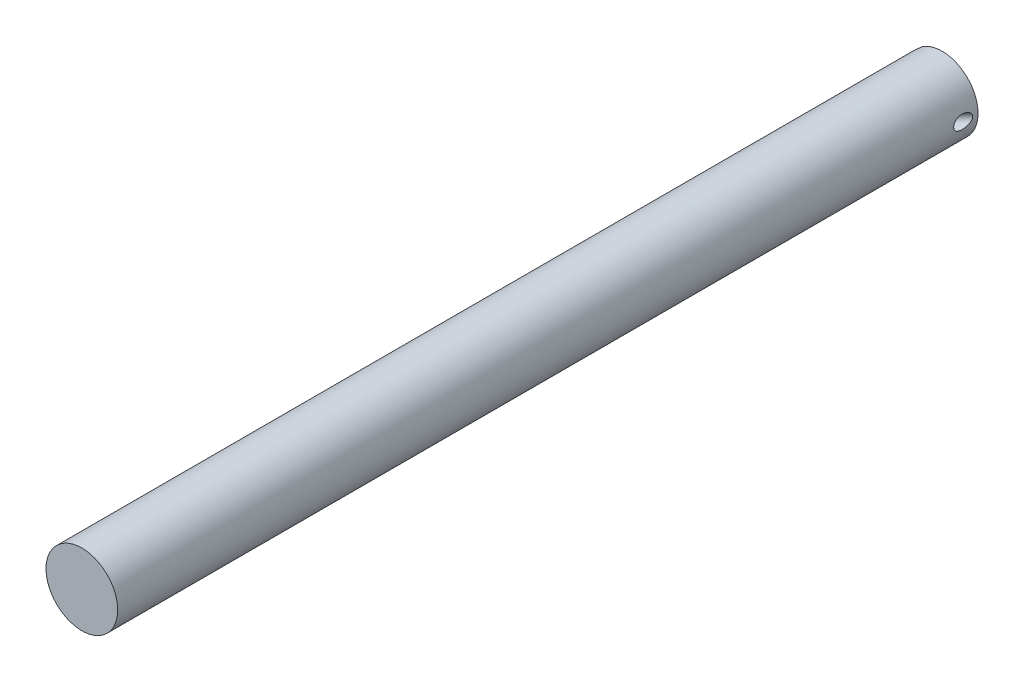
ISO-10303-21;
HEADER;
FILE_DESCRIPTION(('STEP AP214'),'2;1');
FILE_NAME('part.step','',(''),(''),'','','');
FILE_SCHEMA(('AUTOMOTIVE_DESIGN { 1 0 10303 214 1 1 1 1 }'));
ENDSEC;
DATA;
#1=APPLICATION_CONTEXT('core data for automotive mechanical design processes');
#2=APPLICATION_PROTOCOL_DEFINITION('international standard','automotive_design',2000,#1);
#3=PRODUCT_CONTEXT('',#1,'mechanical');
#4=PRODUCT('Part','Part','',(#3));
#5=PRODUCT_RELATED_PRODUCT_CATEGORY('part','',(#4));
#6=PRODUCT_DEFINITION_FORMATION('','',#4);
#7=PRODUCT_DEFINITION_CONTEXT('part definition',#1,'design');
#8=PRODUCT_DEFINITION('design','',#6,#7);
#9=PRODUCT_DEFINITION_SHAPE('','',#8);
#10=(LENGTH_UNIT() NAMED_UNIT(*) SI_UNIT(.MILLI.,.METRE.));
#11=(NAMED_UNIT(*) PLANE_ANGLE_UNIT() SI_UNIT($,.RADIAN.));
#12=(NAMED_UNIT(*) SI_UNIT($,.STERADIAN.) SOLID_ANGLE_UNIT());
#13=UNCERTAINTY_MEASURE_WITH_UNIT(LENGTH_MEASURE(1.E-05),#10,'distance_accuracy_value','');
#14=(GEOMETRIC_REPRESENTATION_CONTEXT(3) GLOBAL_UNCERTAINTY_ASSIGNED_CONTEXT((#13)) GLOBAL_UNIT_ASSIGNED_CONTEXT((#10,
#11,#12)) REPRESENTATION_CONTEXT('',''));
#15=CARTESIAN_POINT('',(0.,0.,0.));
#16=DIRECTION('',(0.,0.,1.));
#17=DIRECTION('',(1.,0.,0.));
#18=AXIS2_PLACEMENT_3D('',#15,#16,#17);
#19=CARTESIAN_POINT('',(0.,0.,304.8));
#20=DIRECTION('',(0.,0.,-1.));
#21=DIRECTION('',(-1.,0.,0.));
#22=AXIS2_PLACEMENT_3D('',#19,#20,#21);
#23=CYLINDRICAL_SURFACE('',#22,12.7);
#24=CARTESIAN_POINT('',(0.,0.,0.));
#25=DIRECTION('',(0.,0.,1.));
#26=DIRECTION('',(1.,0.,0.));
#27=AXIS2_PLACEMENT_3D('',#24,#25,#26);
#28=CIRCLE('',#27,12.7);
#29=CARTESIAN_POINT('',(-7.18420489685536,-10.4726882890688,0.));
#30=VERTEX_POINT('',#29);
#31=CARTESIAN_POINT('',(-7.18420489685536,10.4726882890688,0.));
#32=VERTEX_POINT('',#31);
#33=EDGE_CURVE('E97',#30,#32,#28,.T.);
#34=ORIENTED_EDGE('',*,*,#33,.T.);
#35=CARTESIAN_POINT('',(0.,0.,-7.18420489685528));
#36=DIRECTION('',(0.707106781186544,0.,0.707106781186551));
#37=DIRECTION('',(0.707106781186551,0.,-0.707106781186544));
#38=AXIS2_PLACEMENT_3D('',#35,#36,#37);
#39=ELLIPSE('',#38,17.9605122421382,12.7);
#40=EDGE_CURVE('E66',#32,#30,#39,.T.);
#41=ORIENTED_EDGE('',*,*,#40,.T.);
#42=EDGE_LOOP('',(#34,#41));
#43=FACE_BOUND('',#42,.T.);
#44=CARTESIAN_POINT('',(0.,0.,304.8));
#45=DIRECTION('',(0.,0.,1.));
#46=DIRECTION('',(1.,0.,0.));
#47=AXIS2_PLACEMENT_3D('',#44,#45,#46);
#48=CIRCLE('',#47,12.7);
#49=CARTESIAN_POINT('',(12.7,0.,304.8));
#50=VERTEX_POINT('',#49);
#51=EDGE_CURVE('E101',#50,#50,#48,.T.);
#52=ORIENTED_EDGE('',*,*,#51,.F.);
#53=EDGE_LOOP('',(#52));
#54=FACE_BOUND('',#53,.T.);
#55=CARTESIAN_POINT('',(12.6999999999999,0.,8.62810828753938));
#56=CARTESIAN_POINT('',(12.6999971319786,0.11373770875861,8.62809782493057));
#57=CARTESIAN_POINT('',(12.6984533424594,0.227597051934321,8.61804922853281));
#58=CARTESIAN_POINT('',(12.6924572192031,0.451859376601861,8.57835981793551));
#59=CARTESIAN_POINT('',(12.6880002739569,0.562256586692913,8.54868793930862));
#60=CARTESIAN_POINT('',(12.6767232157731,0.77595206320112,8.47145155220222));
#61=CARTESIAN_POINT('',(12.6699122438964,0.879275963714225,8.42395619482205));
#62=CARTESIAN_POINT('',(12.65464619015,1.07692957675169,8.31330233372744));
#63=CARTESIAN_POINT('',(12.6461912635282,1.17126013731601,8.250145308879));
#64=CARTESIAN_POINT('',(12.6279217762611,1.35445497070078,8.10679307221089));
#65=CARTESIAN_POINT('',(12.6180576926895,1.4427212448389,8.02584423501028));
#66=CARTESIAN_POINT('',(12.5982141214559,1.60680917858928,7.85225753823318));
#67=CARTESIAN_POINT('',(12.5882345729188,1.68262392056053,7.75961323126541));
#68=CARTESIAN_POINT('',(12.564379632614,1.85391518139636,7.52023797144256));
#69=CARTESIAN_POINT('',(12.5508405796145,1.94223512952511,7.36832976395672));
#70=CARTESIAN_POINT('',(12.5265412915488,2.0932225095407,7.05203991809518));
#71=CARTESIAN_POINT('',(12.5157871275328,2.15583406821598,6.88763202238021));
#72=CARTESIAN_POINT('',(12.4949858380187,2.27379170051919,6.49717780958616));
#73=CARTESIAN_POINT('',(12.486286818466,2.32027277629726,6.26836176711457));
#74=CARTESIAN_POINT('',(12.4783540608858,2.36236729673578,5.92205933490711));
#75=CARTESIAN_POINT('',(12.4765630934586,2.37179053233315,5.80601260116037));
#76=CARTESIAN_POINT('',(12.4746397922965,2.38188957420452,5.57352034651925));
#77=CARTESIAN_POINT('',(12.4745074457393,2.38256544810185,5.45707482871471));
#78=CARTESIAN_POINT('',(12.4765510581496,2.37188672091498,5.10328515684809));
#79=CARTESIAN_POINT('',(12.4812716377639,2.3472850484156,4.8661931982996));
#80=CARTESIAN_POINT('',(12.4926696922231,2.28551409868691,4.51537740369117));
#81=CARTESIAN_POINT('',(12.4971913911168,2.26076336359933,4.39919455505617));
#82=CARTESIAN_POINT('',(12.5075189213091,2.20291921786871,4.16895264575401));
#83=CARTESIAN_POINT('',(12.5133245832747,2.16982690725828,4.05489330718031));
#84=CARTESIAN_POINT('',(12.5252971230031,2.09953420564742,3.84286254495058));
#85=CARTESIAN_POINT('',(12.5313418923489,2.06327002720987,3.74457249337941));
#86=CARTESIAN_POINT('',(12.5441496128162,1.98391736348096,3.5508392272295));
#87=CARTESIAN_POINT('',(12.5509124359522,1.94083009366337,3.45539550919327));
#88=CARTESIAN_POINT('',(12.5649797336141,1.8475680538975,3.26820627594691));
#89=CARTESIAN_POINT('',(12.5722835134905,1.79740230105187,3.17645624366465));
#90=CARTESIAN_POINT('',(12.5872305418089,1.68955231694368,2.99755949959075));
#91=CARTESIAN_POINT('',(12.5948736195056,1.63187183967576,2.91041051967903));
#92=CARTESIAN_POINT('',(12.612282973033,1.4921539051402,2.71969001084434));
#93=CARTESIAN_POINT('',(12.622077158346,1.40770605782745,2.61785567089207));
#94=CARTESIAN_POINT('',(12.6411207247394,1.22494143421868,2.42738266382474));
#95=CARTESIAN_POINT('',(12.6503708623785,1.12664459538375,2.33872539714301));
#96=CARTESIAN_POINT('',(12.6653928168115,0.940413879692788,2.19868162832541));
#97=CARTESIAN_POINT('',(12.6714720679918,0.85543708276165,2.14342824566134));
#98=CARTESIAN_POINT('',(12.6822200605232,0.67763028865964,2.04721048638576));
#99=CARTESIAN_POINT('',(12.6868907996329,0.584811655591836,2.0062258588535));
#100=CARTESIAN_POINT('',(12.693704962611,0.407952128563969,1.94693396634566));
#101=CARTESIAN_POINT('',(12.6961276710582,0.324776311849415,1.9260985347771));
#102=CARTESIAN_POINT('',(12.6993204256849,0.156072928502487,1.89870322922189));
#103=CARTESIAN_POINT('',(12.7000915074846,0.0705468696422881,1.89213440959908));
#104=CARTESIAN_POINT('',(12.6998909215526,-0.100423457057528,1.89384808465933));
#105=CARTESIAN_POINT('',(12.6989177955728,-0.185867596646691,1.90214300619903));
#106=CARTESIAN_POINT('',(12.6953413338863,-0.354135455727669,1.93286578148665));
#107=CARTESIAN_POINT('',(12.6927369018493,-0.436957373581436,1.95530313981858));
#108=CARTESIAN_POINT('',(12.68541645302,-0.616451360596662,2.01914526276462));
#109=CARTESIAN_POINT('',(12.6803545298389,-0.711979628741783,2.06370683068989));
#110=CARTESIAN_POINT('',(12.6687954330935,-0.894443824488474,2.16769293198898));
#111=CARTESIAN_POINT('',(12.6622958250454,-0.98136481125724,2.22714269893322));
#112=CARTESIAN_POINT('',(12.6454472405234,-1.18183752507321,2.38554533681141));
#113=CARTESIAN_POINT('',(12.634650458576,-1.29061363065493,2.4904544091119));
#114=CARTESIAN_POINT('',(12.6126291456614,-1.49055028216729,2.7158351673014));
#115=CARTESIAN_POINT('',(12.6014037124746,-1.58167090762306,2.83634111687203));
#116=CARTESIAN_POINT('',(12.5821082243437,-1.727582908367,3.05740200648471));
#117=CARTESIAN_POINT('',(12.5739327442248,-1.78582693980838,3.15571481418542));
#118=CARTESIAN_POINT('',(12.5581458663134,-1.89366007951776,3.3570688711909));
#119=CARTESIAN_POINT('',(12.5505347544499,-1.94324481768888,3.46011247505545));
#120=CARTESIAN_POINT('',(12.5361105379724,-2.03422020001439,3.6698967879334));
#121=CARTESIAN_POINT('',(12.5292981571794,-2.07560343493894,3.77664073849419));
#122=CARTESIAN_POINT('',(12.5166732724235,-2.15042486007303,3.99290395193508));
#123=CARTESIAN_POINT('',(12.5108606162105,-2.18386426036287,4.10242278930167));
#124=CARTESIAN_POINT('',(12.5001996345572,-2.2440999189909,4.32780407493152));
#125=CARTESIAN_POINT('',(12.4953964142886,-2.27059501298341,4.4437493404606));
#126=CARTESIAN_POINT('',(12.4871983781956,-2.31524813999111,4.67729276117707));
#127=CARTESIAN_POINT('',(12.4838040532589,-2.33340326742815,4.7948914777304));
#128=CARTESIAN_POINT('',(12.4759531892293,-2.37519012728234,5.14910624452976));
#129=CARTESIAN_POINT('',(12.4738143893912,-2.38622072062735,5.38743217901117));
#130=CARTESIAN_POINT('',(12.4763854262226,-2.37272205113291,5.84433018331078));
#131=CARTESIAN_POINT('',(12.480572126969,-2.3509094999168,6.06298782948127));
#132=CARTESIAN_POINT('',(12.4949601726286,-2.27324297343286,6.49410002881361));
#133=CARTESIAN_POINT('',(12.5051541831602,-2.2174305061866,6.70656181515549));
#134=CARTESIAN_POINT('',(12.5275497654586,-2.08653900798866,7.06588708358759));
#135=CARTESIAN_POINT('',(12.5386086071325,-2.01978955492549,7.21584999611699));
#136=CARTESIAN_POINT('',(12.5628101767019,-1.86335028799411,7.50314832306523));
#137=CARTESIAN_POINT('',(12.5759497941612,-1.77369459460284,7.64050210956843));
#138=CARTESIAN_POINT('',(12.6003149719503,-1.59024501148045,7.87207669135115));
#139=CARTESIAN_POINT('',(12.6114265735178,-1.50051468515135,7.9695244909145));
#140=CARTESIAN_POINT('',(12.6330466488551,-1.3060083831839,8.14850350206588));
#141=CARTESIAN_POINT('',(12.6435550687062,-1.20123106540994,8.23003329229447));
#142=CARTESIAN_POINT('',(12.657975879026,-1.03384487819375,8.33750826463793));
#143=CARTESIAN_POINT('',(12.6625784090404,-0.976036811632408,8.37099053268202));
#144=CARTESIAN_POINT('',(12.6711580170766,-0.857484036324238,8.43234249954731));
#145=CARTESIAN_POINT('',(12.6751354325047,-0.796740935075283,8.46021522841798));
#146=CARTESIAN_POINT('',(12.6823122820457,-0.672900319741484,8.50985213150572));
#147=CARTESIAN_POINT('',(12.6855132210832,-0.609807637883641,8.53162813490825));
#148=CARTESIAN_POINT('',(12.6910210119984,-0.481755608571782,8.56875960359139));
#149=CARTESIAN_POINT('',(12.6933284058164,-0.416797418322317,8.58411896105062));
#150=CARTESIAN_POINT('',(12.696744031434,-0.293330277490591,8.6067408549964));
#151=CARTESIAN_POINT('',(12.6979612286689,-0.234959302821683,8.61474216877285));
#152=CARTESIAN_POINT('',(12.6995899472221,-0.117736413068172,8.62542853963737));
#153=CARTESIAN_POINT('',(12.7000014848374,-0.0588845077361125,8.62811370426157));
#154=CARTESIAN_POINT('',(12.6999999999999,0.,8.62810828753938));
#155=B_SPLINE_CURVE_WITH_KNOTS('',3,(#55,#56,#57,#58,#59,#60,#61,#62,#63,#64,#65,#66,#67,#68,
#69,#70,#71,#72,#73,#74,#75,#76,#77,#78,#79,#80,#81,#82,#83,#84,#85,#86,#87,#88,#89,#90,#91,#92,
#93,#94,#95,#96,#97,#98,#99,#100,#101,#102,#103,#104,#105,#106,#107,#108,#109,#110,#111,#112,
#113,#114,#115,#116,#117,#118,#119,#120,#121,#122,#123,#124,#125,#126,#127,#128,#129,#130,#131,
#132,#133,#134,#135,#136,#137,#138,#139,#140,#141,#142,#143,#144,#145,#146,#147,#148,#149,#150,
#151,#152,#153,#154),.UNSPECIFIED.,.T.,.F.,(4,2,2,2,2,2,2,2,2,2,2,2,2,2,2,2,2,2,2,2,2,2,2,2,2,2,
2,2,2,2,2,2,2,2,2,2,2,2,2,2,2,2,2,2,2,2,2,2,2,4),(0.,0.340982101289508,0.682505286885447,
1.02271691279504,1.36289642616282,1.72204239164007,2.0813872161511,2.60716302187791,
3.1340755476759,3.8310266469869,4.18009359414622,4.52915784276849,5.24136197552939,
5.59776454017972,5.95412012934897,6.26870499131254,6.58323387566025,6.89736564733162,
7.21134109132501,7.6081933889894,8.00448009463064,8.30803936588512,8.61116603755278,
8.86737394599905,9.12342115720076,9.37968253700636,9.63611632406049,9.95097647332464,
10.2663739247878,10.7184033085812,11.1714431363144,11.5146944093723,11.8581184140164,
12.2018512673263,12.5455317263613,12.9022884468352,13.2591693644314,13.9720342060903,
14.6290816834805,15.2853286225144,15.777171010911,16.2682849935492,16.6655650116392,
17.0628804876624,17.2635175585478,17.4640459606766,17.6641825473204,17.8641975591802,
18.0407350467557,18.2172689632589),.UNSPECIFIED.);
#156=CARTESIAN_POINT('',(12.6999999999999,0.,8.62810828753938));
#157=VERTEX_POINT('',#156);
#158=EDGE_CURVE('E104',#157,#157,#155,.T.);
#159=ORIENTED_EDGE('',*,*,#158,.T.);
#160=EDGE_LOOP('',(#159));
#161=FACE_BOUND('',#160,.T.);
#162=CARTESIAN_POINT('',(-12.2403337367663,-3.38588688715096,27.272793195938));
#163=CARTESIAN_POINT('',(-12.2196674640612,-3.46045383977976,27.4246129192115));
#164=CARTESIAN_POINT('',(-12.2005542629207,-3.5270399628867,27.5803870391927));
#165=CARTESIAN_POINT('',(-12.1658428331486,-3.64503725053378,27.8976240342367));
#166=CARTESIAN_POINT('',(-12.1502376584458,-3.69647846646983,28.0590749223147));
#167=CARTESIAN_POINT('',(-12.1229979211142,-3.78483398918307,28.3844860786729));
#168=CARTESIAN_POINT('',(-12.1113264183075,-3.82188397417107,28.5484069786533));
#169=CARTESIAN_POINT('',(-12.0918255367561,-3.88314266112652,28.8789302680043));
#170=CARTESIAN_POINT('',(-12.0839985940945,-3.90734322191479,29.0455342886544));
#171=CARTESIAN_POINT('',(-12.070591055056,-3.94859923553227,29.4243723959408));
#172=CARTESIAN_POINT('',(-12.0661496186444,-3.962079767576,29.6370370837985));
#173=CARTESIAN_POINT('',(-12.0630336691128,-3.97155205342014,30.0627641229087));
#174=CARTESIAN_POINT('',(-12.0643599514162,-3.96754139501873,30.2758265249595));
#175=CARTESIAN_POINT('',(-12.0723230222069,-3.94324459630414,30.7020677671573));
#176=CARTESIAN_POINT('',(-12.0789888349864,-3.92286950158092,30.9152408627159));
#177=CARTESIAN_POINT('',(-12.0971012444487,-3.86665349270027,31.3392970585468));
#178=CARTESIAN_POINT('',(-12.108547513485,-3.8308136384728,31.5501803147457));
#179=CARTESIAN_POINT('',(-12.1359514784251,-3.74310675130942,31.9738099159133));
#180=CARTESIAN_POINT('',(-12.15201477246,-3.69086156031925,32.1864711101465));
#181=CARTESIAN_POINT('',(-12.1878426214733,-3.57077338346765,32.6070841946828));
#182=CARTESIAN_POINT('',(-12.2076080238936,-3.50292682551849,32.8150349944979));
#183=CARTESIAN_POINT('',(-12.2500391065676,-3.3515240523671,33.2240976616958));
#184=CARTESIAN_POINT('',(-12.272695296209,-3.26801884188796,33.4252292975753));
#185=CARTESIAN_POINT('',(-12.3201391132865,-3.08434258980398,33.8193666302832));
#186=CARTESIAN_POINT('',(-12.3449253684436,-2.98418223982997,34.0123774412453));
#187=CARTESIAN_POINT('',(-12.3980189724521,-2.75574975011194,34.4049523657996));
#188=CARTESIAN_POINT('',(-12.4264411912347,-2.62574595472135,34.6035060494497));
#189=CARTESIAN_POINT('',(-12.4831277701999,-2.34148407038805,34.9827178291624));
#190=CARTESIAN_POINT('',(-12.511392213359,-2.18724028449238,35.1633863767027));
#191=CARTESIAN_POINT('',(-12.5596861882094,-1.88735979672359,35.4623331021216));
#192=CARTESIAN_POINT('',(-12.5801852728702,-1.7469198996464,35.5856954068001));
#193=CARTESIAN_POINT('',(-12.6180516645094,-1.44821009376826,35.8092704692864));
#194=CARTESIAN_POINT('',(-12.6354249828796,-1.28997538137487,35.9095277686972));
#195=CARTESIAN_POINT('',(-12.6611856771506,-0.999866166719827,36.05636818832));
#196=CARTESIAN_POINT('',(-12.670734995173,-0.871756378728673,36.1101268382262));
#197=CARTESIAN_POINT('',(-12.6861077342991,-0.608286503909871,36.1961926184825));
#198=CARTESIAN_POINT('',(-12.6919351164275,-0.472934291620871,36.2285225554656));
#199=CARTESIAN_POINT('',(-12.6992116176179,-0.197638431206163,36.2688387664231));
#200=CARTESIAN_POINT('',(-12.7006349342529,-0.0576725619284679,36.2766815782641));
#201=CARTESIAN_POINT('',(-12.698837869953,0.221322407617087,36.266749816781));
#202=CARTESIAN_POINT('',(-12.6956167786139,0.360351361307044,36.2489713244468));
#203=CARTESIAN_POINT('',(-12.6853813534612,0.622014551870811,36.1920796460861));
#204=CARTESIAN_POINT('',(-12.6786913727207,0.745070201837775,36.1547885818711));
#205=CARTESIAN_POINT('',(-12.6623688244859,0.984284620875061,36.0629556568689));
#206=CARTESIAN_POINT('',(-12.6527350124251,1.10044044804524,36.0084064995152));
#207=CARTESIAN_POINT('',(-12.6253152978752,1.3863292416289,35.8512569855426));
#208=CARTESIAN_POINT('',(-12.6059585675664,1.55043522620581,35.7387227175428));
#209=CARTESIAN_POINT('',(-12.5641963102671,1.85886151068497,35.489576832926));
#210=CARTESIAN_POINT('',(-12.541782253019,2.00312409963314,35.3528975225902));
#211=CARTESIAN_POINT('',(-12.5002638916159,2.24619252913592,35.09154924176));
#212=CARTESIAN_POINT('',(-12.4813866050456,2.34833548704604,34.969888035629));
#213=CARTESIAN_POINT('',(-12.4434560993321,2.54167639311338,34.7181157816671));
#214=CARTESIAN_POINT('',(-12.4244027809319,2.63286770186149,34.5879996809974));
#215=CARTESIAN_POINT('',(-12.3866242982712,2.80523263531999,34.32096707141));
#216=CARTESIAN_POINT('',(-12.3678997653273,2.88638848395421,34.1840390812192));
#217=CARTESIAN_POINT('',(-12.3312411991662,3.0391862240107,33.9049242134936));
#218=CARTESIAN_POINT('',(-12.3133070945709,3.11082897567643,33.7627378129513));
#219=CARTESIAN_POINT('',(-12.2704074924496,3.27682075494684,33.4060309997327));
#220=CARTESIAN_POINT('',(-12.2461105179309,3.36596301442228,33.1889952188452));
#221=CARTESIAN_POINT('',(-12.2010052577643,3.52595473603677,32.7478748732219));
#222=CARTESIAN_POINT('',(-12.1801986842802,3.59679522966739,32.5237869127793));
#223=CARTESIAN_POINT('',(-12.1429636824796,3.72056580267409,32.0701433298728));
#224=CARTESIAN_POINT('',(-12.1265392815498,3.77347941851904,31.8405828875709));
#225=CARTESIAN_POINT('',(-12.0989461144652,3.86103807380721,31.3777502019756));
#226=CARTESIAN_POINT('',(-12.0877755644162,3.89568931454628,31.1444792464037));
#227=CARTESIAN_POINT('',(-12.0729244437518,3.94144045292059,30.7172061518791));
#228=CARTESIAN_POINT('',(-12.0682677871568,3.95562437662479,30.5235655228665));
#229=CARTESIAN_POINT('',(-12.0634542828972,3.97028187681669,30.1356730956172));
#230=CARTESIAN_POINT('',(-12.0632976462805,3.97075481026838,29.9414212691432));
#231=CARTESIAN_POINT('',(-12.0678204683504,3.95699004287311,29.5543612382292));
#232=CARTESIAN_POINT('',(-12.0724774526623,3.94282070558345,29.3615505204009));
#233=CARTESIAN_POINT('',(-12.0868107452287,3.89865834994165,28.9780080331273));
#234=CARTESIAN_POINT('',(-12.096485020209,3.86867174150876,28.7872754534546));
#235=CARTESIAN_POINT('',(-12.1235048295729,3.78326883134902,28.3695569823566));
#236=CARTESIAN_POINT('',(-12.142039540388,3.72381745098503,28.1434286817473));
#237=CARTESIAN_POINT('',(-12.1751042376723,3.61362397901262,27.8111686010879));
#238=CARTESIAN_POINT('',(-12.1870436683142,3.57324770393538,27.701273632933));
#239=CARTESIAN_POINT('',(-12.2125265831856,3.48514952825051,27.4845504630117));
#240=CARTESIAN_POINT('',(-12.2260714862738,3.43742111876324,27.3777250791751));
#241=CARTESIAN_POINT('',(-12.2403337367663,3.38588688715095,27.272793195938));
#242=B_SPLINE_CURVE_WITH_KNOTS('',3,(#162,#163,#164,#165,#166,#167,#168,#169,#170,#171,#172,
#173,#174,#175,#176,#177,#178,#179,#180,#181,#182,#183,#184,#185,#186,#187,#188,#189,#190,#191,
#192,#193,#194,#195,#196,#197,#198,#199,#200,#201,#202,#203,#204,#205,#206,#207,#208,#209,#210,
#211,#212,#213,#214,#215,#216,#217,#218,#219,#220,#221,#222,#223,#224,#225,#226,#227,#228,#229,
#230,#231,#232,#233,#234,#235,#236,#237,#238,#239,#240,#241),.UNSPECIFIED.,.F.,.F.,(4,2,2,2,2,2,
2,2,2,2,2,2,2,2,2,2,2,2,2,2,2,2,2,2,2,2,2,2,2,2,2,2,2,2,2,2,2,2,2,4),(0.,0.51073731285378,
1.02045425337734,1.52524173346847,2.03034865792681,2.66885273586861,3.30744487239062,
3.94953197771204,4.59157508239482,5.24966378464755,5.90790331312808,6.5640348820737,
7.21974686733952,7.9353223441827,8.65047716307784,9.21290098946326,9.77423133773144,
10.190404867565,10.606134748574,11.0242957294297,11.4425206785777,11.8272605814075,
12.2121633666743,12.8085408138551,13.4066176144639,13.8858864064636,14.3654443026852,
14.8458398411224,15.3261919090723,16.0328769235741,16.7399075845115,17.4475858131283,
18.1550235826497,18.7371804631269,19.3193646463174,19.8988428870554,20.4780864755429,
21.1797522631259,21.5325605730077,21.885683040165),.UNSPECIFIED.);
#243=CARTESIAN_POINT('',(-12.2403337367662,-3.38588688715103,27.2727931959381));
#244=VERTEX_POINT('',#243);
#245=CARTESIAN_POINT('',(-12.2403337367662,3.38588688715103,27.2727931959381));
#246=VERTEX_POINT('',#245);
#247=EDGE_CURVE('E11',#244,#246,#242,.T.);
#248=ORIENTED_EDGE('',*,*,#247,.F.);
#249=CARTESIAN_POINT('',(0.,0.,39.5131269327044));
#250=DIRECTION('',(-0.707106781186549,0.,0.707106781186546));
#251=DIRECTION('',(-0.707106781186546,0.,-0.707106781186549));
#252=AXIS2_PLACEMENT_3D('',#249,#250,#251);
#253=ELLIPSE('',#252,17.9605122421383,12.7);
#254=EDGE_CURVE('E73',#246,#244,#253,.T.);
#255=ORIENTED_EDGE('',*,*,#254,.F.);
#256=EDGE_LOOP('',(#248,#255));
#257=FACE_BOUND('',#256,.T.);
#258=ADVANCED_FACE('F39',(#43,#54,#161,#257),#23,.T.);
#259=CARTESIAN_POINT('',(15.3302561210692,0.,2.63025612106917));
#260=DIRECTION('',(-0.707106781186549,0.,0.707106781186546));
#261=DIRECTION('',(0.707106781186546,0.,0.707106781186549));
#262=AXIS2_PLACEMENT_3D('',#259,#260,#261);
#263=CYLINDRICAL_SURFACE('',#262,2.38125);
#264=ORIENTED_EDGE('',*,*,#158,.F.);
#265=EDGE_LOOP('',(#264));
#266=FACE_BOUND('',#265,.T.);
#267=CARTESIAN_POINT('',(-0.292023768205474,-0.244294465377066,14.9027086187649));
#268=CARTESIAN_POINT('',(-0.298461796018081,-0.155887806708231,14.8962611938073));
#269=CARTESIAN_POINT('',(-0.296992607075424,-0.0668434670892464,14.8889381844429));
#270=CARTESIAN_POINT('',(-0.27828403830796,0.109480680759207,14.8724407586452));
#271=CARTESIAN_POINT('',(-0.26101556181855,0.196756929567133,14.8632629506382));
#272=CARTESIAN_POINT('',(-0.21211130128671,0.366456072067372,14.8429593452588));
#273=CARTESIAN_POINT('',(-0.180542928825595,0.448899710752939,14.8318428367069));
#274=CARTESIAN_POINT('',(-0.105087227781106,0.607503803870428,14.8074047261888));
#275=CARTESIAN_POINT('',(-0.0612000678396677,0.683664344298344,14.7940831544106));
#276=CARTESIAN_POINT('',(0.0399047903847246,0.833415261841485,14.7638961525813));
#277=CARTESIAN_POINT('',(0.0978136419770546,0.906500032149971,14.7468542623679));
#278=CARTESIAN_POINT('',(0.2225400738336,1.04360415617815,14.7091440293673));
#279=CARTESIAN_POINT('',(0.289366366953336,1.10761451589704,14.6884721335336));
#280=CARTESIAN_POINT('',(0.443300765150437,1.23773279259971,14.6379868698587));
#281=CARTESIAN_POINT('',(0.531817110255122,1.3017936012977,14.6071759408584));
#282=CARTESIAN_POINT('',(0.714346717369121,1.41550483955697,14.5363746655978));
#283=CARTESIAN_POINT('',(0.808359034322201,1.46515773791521,14.4963858940673));
#284=CARTESIAN_POINT('',(0.976129488081728,1.53920911196737,14.4141907486043));
#285=CARTESIAN_POINT('',(1.0497050853587,1.5667735123595,14.3744897243833));
#286=CARTESIAN_POINT('',(1.1945083288971,1.61120418888701,14.2859752752582));
#287=CARTESIAN_POINT('',(1.26574052914445,1.62809253860886,14.2371809239664));
#288=CARTESIAN_POINT('',(1.40320139348408,1.65020237380352,14.1293742159741));
#289=CARTESIAN_POINT('',(1.46937970618074,1.65531834760956,14.0702745193536));
#290=CARTESIAN_POINT('',(1.59292612961127,1.65309172449041,13.9436883985586));
#291=CARTESIAN_POINT('',(1.65029324583758,1.64574772235024,13.8762010292322));
#292=CARTESIAN_POINT('',(1.74882639284133,1.62085487729614,13.7445356993949));
#293=CARTESIAN_POINT('',(1.79110848812642,1.60462681779579,13.6809221804476));
#294=CARTESIAN_POINT('',(1.86857156474765,1.56384247071792,13.5520609637635));
#295=CARTESIAN_POINT('',(1.90374543032616,1.53927790304953,13.4868117012588));
#296=CARTESIAN_POINT('',(1.98400799937959,1.46850842671502,13.3244013785134));
#297=CARTESIAN_POINT('',(2.02537789801493,1.41761136364474,13.2274424063798));
#298=CARTESIAN_POINT('',(2.09842903238935,1.30044483769678,13.0392097505566));
#299=CARTESIAN_POINT('',(2.13009055112805,1.23414456549934,12.9479479326586));
#300=CARTESIAN_POINT('',(2.18681659353028,1.08606121937702,12.774323982155));
#301=CARTESIAN_POINT('',(2.21178955570441,1.00408724026726,12.692093652118));
#302=CARTESIAN_POINT('',(2.25641165338015,0.826198443702361,12.5427780728046));
#303=CARTESIAN_POINT('',(2.27607283270849,0.730315934546634,12.4756586200752));
#304=CARTESIAN_POINT('',(2.30699327331947,0.551064864396961,12.3753728381132));
#305=CARTESIAN_POINT('',(2.31913560572315,0.470244685586219,12.3379223961993));
#306=CARTESIAN_POINT('',(2.34131116885004,0.30323905412205,12.276885352926));
#307=CARTESIAN_POINT('',(2.35134593341655,0.217057562943557,12.2532886464981));
#308=CARTESIAN_POINT('',(2.36953173105492,0.0412892292195644,12.2215829710814));
#309=CARTESIAN_POINT('',(2.37767479739547,-0.0483102290141936,12.2135384945943));
#310=CARTESIAN_POINT('',(2.39214634591816,-0.227634103658757,12.2137878433396));
#311=CARTESIAN_POINT('',(2.3984748677632,-0.317358517295162,12.2220813114208));
#312=CARTESIAN_POINT('',(2.40905695413042,-0.488220886213076,12.2532669648123));
#313=CARTESIAN_POINT('',(2.41341902293885,-0.569536956891114,12.2751705531022));
#314=CARTESIAN_POINT('',(2.42070988743394,-0.727845060351188,12.3312611247136));
#315=CARTESIAN_POINT('',(2.42363839420421,-0.804836218736038,12.3654505816919));
#316=CARTESIAN_POINT('',(2.42828079196225,-0.959345751369267,12.4475997738512));
#317=CARTESIAN_POINT('',(2.42987462374228,-1.03638416446239,12.4964624778712));
#318=CARTESIAN_POINT('',(2.43138886854596,-1.18306872920343,12.6041987286963));
#319=CARTESIAN_POINT('',(2.43130825550256,-1.25271032195485,12.6630783917819));
#320=CARTESIAN_POINT('',(2.42882182587915,-1.41922602200235,12.8221735899197));
#321=CARTESIAN_POINT('',(2.42520741291167,-1.51099426069188,12.9277683387905));
#322=CARTESIAN_POINT('',(2.41557368787256,-1.6352598378542,13.0956887471319));
#323=CARTESIAN_POINT('',(2.41164914603237,-1.67451122515077,13.1533668468816));
#324=CARTESIAN_POINT('',(2.40201127201347,-1.74861250377657,13.2713419497408));
#325=CARTESIAN_POINT('',(2.3962980910152,-1.78346276675102,13.3316387311416));
#326=CARTESIAN_POINT('',(2.37801724949204,-1.87077708209995,13.4955683718111));
#327=CARTESIAN_POINT('',(2.36342287603818,-1.91935699692011,13.6011162199619));
#328=CARTESIAN_POINT('',(2.33343158616389,-1.98277846580691,13.761419913689));
#329=CARTESIAN_POINT('',(2.32210267136242,-2.00232669118038,13.8151202246858));
#330=CARTESIAN_POINT('',(2.29571919263162,-2.03814021058967,13.9226838259007));
#331=CARTESIAN_POINT('',(2.28066821383507,-2.05440863655151,13.9765469103056));
#332=CARTESIAN_POINT('',(2.24602000826658,-2.08289583706301,14.0818880460567));
#333=CARTESIAN_POINT('',(2.22658516285853,-2.09522835299635,14.1333869718294));
#334=CARTESIAN_POINT('',(2.18133880320301,-2.11602466795943,14.2343187420092));
#335=CARTESIAN_POINT('',(2.15553905308184,-2.12449552307442,14.2837552035385));
#336=CARTESIAN_POINT('',(2.09559625101534,-2.13702005435337,14.3791781568709));
#337=CARTESIAN_POINT('',(2.06132850051958,-2.1410022504938,14.4250982533352));
#338=CARTESIAN_POINT('',(1.98470519763531,-2.14376636936663,14.5097686890375));
#339=CARTESIAN_POINT('',(1.94235901864434,-2.14255428437681,14.5485272362132));
#340=CARTESIAN_POINT('',(1.85893164650034,-2.13571756237707,14.6122191961519));
#341=CARTESIAN_POINT('',(1.81869437616989,-2.1308150684521,14.6383676210449));
#342=CARTESIAN_POINT('',(1.7356372380321,-2.11785811984192,14.6852404983028));
#343=CARTESIAN_POINT('',(1.69281346005288,-2.10979878652584,14.7059564721419));
#344=CARTESIAN_POINT('',(1.56589288402134,-2.08224817081128,14.7599717477043));
#345=CARTESIAN_POINT('',(1.48010322788828,-2.05906384014342,14.7872917542414));
#346=CARTESIAN_POINT('',(1.3085406063095,-2.00427489886727,14.8320603167413));
#347=CARTESIAN_POINT('',(1.22276958222085,-1.97263154713964,14.849462270974));
#348=CARTESIAN_POINT('',(1.06927264570893,-1.90816088149951,14.8754241809445));
#349=CARTESIAN_POINT('',(1.00116347913634,-1.87665393235168,14.8850276962068));
#350=CARTESIAN_POINT('',(0.867180884105858,-1.8085269244625,14.9013077772196));
#351=CARTESIAN_POINT('',(0.801308767018145,-1.77190392885579,14.9079826526066));
#352=CARTESIAN_POINT('',(0.608307458484968,-1.65442175655201,14.9247729308195));
#353=CARTESIAN_POINT('',(0.485412777714056,-1.56579306205551,14.9317075577671));
#354=CARTESIAN_POINT('',(0.286845255965936,-1.39279622378996,14.9389617808291));
#355=CARTESIAN_POINT('',(0.207120331266645,-1.31310010487393,14.9405169384612));
#356=CARTESIAN_POINT('',(0.061186801692315,-1.14207591178356,14.9409757419084));
#357=CARTESIAN_POINT('',(-0.00503863676943872,-1.05076255783697,14.9398827121607));
#358=CARTESIAN_POINT('',(-0.108967352145036,-0.875914361447655,14.9356492176301));
#359=CARTESIAN_POINT('',(-0.149695405963951,-0.79416909811995,14.9329345701241));
#360=CARTESIAN_POINT('',(-0.217153574330685,-0.625248118097912,14.9258392270317));
#361=CARTESIAN_POINT('',(-0.243920055007927,-0.538087178041661,14.9214629116033));
#362=CARTESIAN_POINT('',(-0.269990891156626,-0.415580719808684,14.9142280850374));
#363=CARTESIAN_POINT('',(-0.276040382139219,-0.381538818544294,14.9121055435714));
#364=CARTESIAN_POINT('',(-0.285802248113868,-0.313128471437511,14.9076026194229));
#365=CARTESIAN_POINT('',(-0.289513893898614,-0.278759927100252,14.9052221565621));
#366=CARTESIAN_POINT('',(-0.292023768205474,-0.244294465377066,14.9027086187649));
#367=B_SPLINE_CURVE_WITH_KNOTS('',3,(#267,#268,#269,#270,#271,#272,#273,#274,#275,#276,#277,
#278,#279,#280,#281,#282,#283,#284,#285,#286,#287,#288,#289,#290,#291,#292,#293,#294,#295,#296,
#297,#298,#299,#300,#301,#302,#303,#304,#305,#306,#307,#308,#309,#310,#311,#312,#313,#314,#315,
#316,#317,#318,#319,#320,#321,#322,#323,#324,#325,#326,#327,#328,#329,#330,#331,#332,#333,#334,
#335,#336,#337,#338,#339,#340,#341,#342,#343,#344,#345,#346,#347,#348,#349,#350,#351,#352,#353,
#354,#355,#356,#357,#358,#359,#360,#361,#362,#363,#364,#365,#366),.UNSPECIFIED.,.T.,.F.,(4,2,2,
2,2,2,2,2,2,2,2,2,2,2,2,2,2,2,2,2,2,2,2,2,2,2,2,2,2,2,2,2,2,2,2,2,2,2,2,2,2,2,2,2,2,2,2,2,2,4),
(0.,0.266478521474546,0.53344879155511,0.799173419467982,1.06489440983695,1.34824165288346,
1.63186779780045,1.97107489145607,2.31022382757165,2.57336752510162,2.83596535707569,
3.10090774468829,3.36588001404105,3.59926718749962,3.83288685043003,4.1822248719799,
4.53226774448022,4.88688238582205,5.24068610155834,5.50927257031628,5.77766288494056,
6.04716380205307,6.31665882787949,6.56855691649598,6.82050575112568,7.09322867849221,
7.36611873006494,7.7835043824158,7.99298043628921,8.20243878947985,8.55252967228811,
8.72716318414372,8.90162913782017,9.07046505742357,9.23899122864153,9.41016478409614,
9.58114092181846,9.72529179401765,9.86966632386908,10.1469894814528,10.4256051703516,
10.6522820179253,10.8790895281399,11.3314738646927,11.6685512095348,12.0052056191555,
12.2782586235954,12.5505968015873,12.65445145477,12.7583384856818),.UNSPECIFIED.);
#368=CARTESIAN_POINT('',(-0.292023768205474,-0.244294465377066,14.9027086187649));
#369=VERTEX_POINT('',#368);
#370=EDGE_CURVE('E109',#369,#369,#367,.T.);
#371=ORIENTED_EDGE('',*,*,#370,.T.);
#372=EDGE_LOOP('',(#371));
#373=FACE_BOUND('',#372,.T.);
#374=CARTESIAN_POINT('',(-10.776307345283,0.,28.7368195874213));
#375=DIRECTION('',(-0.707106781186549,0.,0.707106781186546));
#376=DIRECTION('',(0.707106781186546,0.,0.707106781186549));
#377=AXIS2_PLACEMENT_3D('',#374,#375,#376);
#378=CIRCLE('',#377,2.38125);
#379=CARTESIAN_POINT('',(-9.09250932258258,0.,30.4206176101218));
#380=VERTEX_POINT('',#379);
#381=EDGE_CURVE('E79',#380,#380,#378,.F.);
#382=ORIENTED_EDGE('',*,*,#381,.F.);
#383=EDGE_LOOP('',(#382));
#384=FACE_BOUND('',#383,.T.);
#385=ADVANCED_FACE('F86',(#266,#373,#384),#263,.F.);
#386=CARTESIAN_POINT('',(-14.3761772569918,18.6651796988571,7.19197236013632));
#387=DIRECTION('',(0.707106781186544,0.,0.707106781186551));
#388=DIRECTION('',(0.707106781186551,0.,-0.707106781186544));
#389=AXIS2_PLACEMENT_3D('',#386,#387,#388);
#390=PLANE('',#389);
#391=DIRECTION('',(0.,1.,0.));
#392=VECTOR('',#391,1.);
#393=CARTESIAN_POINT('',(-7.18420489685536,0.,0.));
#394=LINE('',#393,#392);
#395=EDGE_CURVE('E52',#30,#32,#394,.T.);
#396=ORIENTED_EDGE('',*,*,#395,.F.);
#397=ORIENTED_EDGE('',*,*,#40,.F.);
#398=EDGE_LOOP('',(#396,#397));
#399=FACE_BOUND('',#398,.T.);
#400=CARTESIAN_POINT('',(-9.84692035181298,-0.244294465377066,2.66271545495758));
#401=DIRECTION('',(-0.707106781186544,0.,-0.707106781186551));
#402=DIRECTION('',(-0.707106781186551,0.,0.707106781186544));
#403=AXIS2_PLACEMENT_3D('',#400,#401,#402);
#404=CIRCLE('',#403,1.89864999999999);
#405=CARTESIAN_POINT('',(-11.1894686419128,-0.244294465377066,4.0052637450574));
#406=VERTEX_POINT('',#405);
#407=EDGE_CURVE('E78',#406,#406,#404,.T.);
#408=ORIENTED_EDGE('',*,*,#407,.F.);
#409=EDGE_LOOP('',(#408));
#410=FACE_BOUND('',#409,.T.);
#411=ADVANCED_FACE('F91',(#399,#410),#390,.F.);
#412=CARTESIAN_POINT('',(0.,0.,304.8));
#413=DIRECTION('',(0.,0.,1.));
#414=DIRECTION('',(1.,0.,0.));
#415=AXIS2_PLACEMENT_3D('',#412,#413,#414);
#416=PLANE('',#415);
#417=ORIENTED_EDGE('',*,*,#51,.T.);
#418=EDGE_LOOP('',(#417));
#419=FACE_BOUND('',#418,.T.);
#420=ADVANCED_FACE('F119',(#419),#416,.T.);
#421=CARTESIAN_POINT('',(0.,0.,0.));
#422=DIRECTION('',(0.,0.,1.));
#423=DIRECTION('',(1.,0.,0.));
#424=AXIS2_PLACEMENT_3D('',#421,#422,#423);
#425=PLANE('',#424);
#426=ORIENTED_EDGE('',*,*,#33,.F.);
#427=ORIENTED_EDGE('',*,*,#395,.T.);
#428=EDGE_LOOP('',(#426,#427));
#429=FACE_BOUND('',#428,.T.);
#430=ADVANCED_FACE('F121',(#429),#425,.F.);
#431=CARTESIAN_POINT('',(-9.84692035181297,-0.244294465377066,2.66271545495758));
#432=DIRECTION('',(-0.707106781186544,0.,-0.707106781186551));
#433=DIRECTION('',(-0.707106781186551,0.,0.707106781186544));
#434=AXIS2_PLACEMENT_3D('',#431,#432,#433);
#435=CYLINDRICAL_SURFACE('',#434,1.89864999999999);
#436=ORIENTED_EDGE('',*,*,#370,.F.);
#437=EDGE_LOOP('',(#436));
#438=FACE_BOUND('',#437,.T.);
#439=ORIENTED_EDGE('',*,*,#407,.T.);
#440=EDGE_LOOP('',(#439));
#441=FACE_BOUND('',#440,.T.);
#442=ADVANCED_FACE('F124',(#438,#441),#435,.F.);
#443=CARTESIAN_POINT('',(-149.769743878931,0.,167.730256121069));
#444=DIRECTION('',(0.707106781186549,0.,-0.707106781186546));
#445=DIRECTION('',(-0.707106781186546,0.,-0.707106781186549));
#446=AXIS2_PLACEMENT_3D('',#443,#444,#445);
#447=CYLINDRICAL_SURFACE('',#446,3.96875);
#448=ORIENTED_EDGE('',*,*,#247,.T.);
#449=CARTESIAN_POINT('',(-10.776307345283,0.,28.7368195874213));
#450=DIRECTION('',(-0.707106781186549,0.,0.707106781186546));
#451=DIRECTION('',(0.707106781186546,0.,0.707106781186549));
#452=AXIS2_PLACEMENT_3D('',#449,#450,#451);
#453=CIRCLE('',#452,3.96875);
#454=EDGE_CURVE('E60',#244,#246,#453,.T.);
#455=ORIENTED_EDGE('',*,*,#454,.F.);
#456=EDGE_LOOP('',(#448,#455));
#457=FACE_BOUND('',#456,.T.);
#458=ADVANCED_FACE('F82',(#457),#447,.F.);
#459=CARTESIAN_POINT('',(-10.776307345283,0.,28.7368195874213));
#460=DIRECTION('',(-0.707106781186549,0.,0.707106781186546));
#461=DIRECTION('',(0.707106781186546,0.,0.707106781186549));
#462=AXIS2_PLACEMENT_3D('',#459,#460,#461);
#463=PLANE('',#462);
#464=ORIENTED_EDGE('',*,*,#381,.T.);
#465=EDGE_LOOP('',(#464));
#466=FACE_BOUND('',#465,.T.);
#467=ORIENTED_EDGE('',*,*,#254,.T.);
#468=ORIENTED_EDGE('',*,*,#454,.T.);
#469=EDGE_LOOP('',(#467,#468));
#470=FACE_BOUND('',#469,.T.);
#471=ADVANCED_FACE('F74',(#466,#470),#463,.T.);
#472=CLOSED_SHELL('',(#258,#385,#411,#420,#430,#442,#458,#471));
#473=MANIFOLD_SOLID_BREP('B2',#472);
#474=ADVANCED_BREP_SHAPE_REPRESENTATION('',(#18,#473),#14);
#475=SHAPE_DEFINITION_REPRESENTATION(#9,#474);
ENDSEC;
END-ISO-10303-21;
